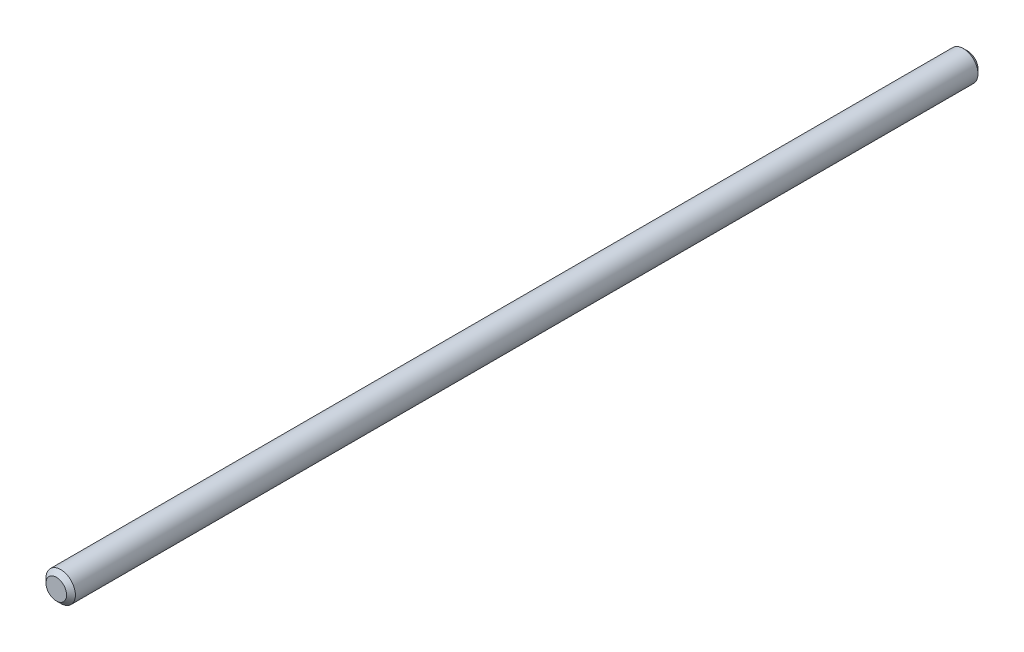
ISO-10303-21;
HEADER;
FILE_DESCRIPTION(('STEP AP214'),'2;1');
FILE_NAME('part.step','',(''),(''),'','','');
FILE_SCHEMA(('AUTOMOTIVE_DESIGN { 1 0 10303 214 1 1 1 1 }'));
ENDSEC;
DATA;
#1=APPLICATION_CONTEXT('core data for automotive mechanical design processes');
#2=APPLICATION_PROTOCOL_DEFINITION('international standard','automotive_design',2000,#1);
#3=PRODUCT_CONTEXT('',#1,'mechanical');
#4=PRODUCT('Part','Part','',(#3));
#5=PRODUCT_RELATED_PRODUCT_CATEGORY('part','',(#4));
#6=PRODUCT_DEFINITION_FORMATION('','',#4);
#7=PRODUCT_DEFINITION_CONTEXT('part definition',#1,'design');
#8=PRODUCT_DEFINITION('design','',#6,#7);
#9=PRODUCT_DEFINITION_SHAPE('','',#8);
#10=(LENGTH_UNIT() NAMED_UNIT(*) SI_UNIT(.MILLI.,.METRE.));
#11=(NAMED_UNIT(*) PLANE_ANGLE_UNIT() SI_UNIT($,.RADIAN.));
#12=(NAMED_UNIT(*) SI_UNIT($,.STERADIAN.) SOLID_ANGLE_UNIT());
#13=UNCERTAINTY_MEASURE_WITH_UNIT(LENGTH_MEASURE(1.E-05),#10,'distance_accuracy_value','');
#14=(GEOMETRIC_REPRESENTATION_CONTEXT(3) GLOBAL_UNCERTAINTY_ASSIGNED_CONTEXT((#13)) GLOBAL_UNIT_ASSIGNED_CONTEXT((#10,
#11,#12)) REPRESENTATION_CONTEXT('',''));
#15=CARTESIAN_POINT('',(0.,0.,0.));
#16=DIRECTION('',(0.,0.,1.));
#17=DIRECTION('',(1.,0.,0.));
#18=AXIS2_PLACEMENT_3D('',#15,#16,#17);
#19=CARTESIAN_POINT('',(0.,0.,155.));
#20=DIRECTION('',(0.,0.,-1.));
#21=DIRECTION('',(-1.,0.,0.));
#22=AXIS2_PLACEMENT_3D('',#19,#20,#21);
#23=CYLINDRICAL_SURFACE('',#22,2.5);
#24=CARTESIAN_POINT('',(0.,0.,0.749999999999945));
#25=DIRECTION('',(0.,0.,1.));
#26=DIRECTION('',(1.,0.,0.));
#27=AXIS2_PLACEMENT_3D('',#24,#25,#26);
#28=CIRCLE('',#27,2.5);
#29=CARTESIAN_POINT('',(2.5,0.,0.749999999999945));
#30=VERTEX_POINT('',#29);
#31=EDGE_CURVE('E42',#30,#30,#28,.T.);
#32=ORIENTED_EDGE('',*,*,#31,.T.);
#33=EDGE_LOOP('',(#32));
#34=FACE_BOUND('',#33,.T.);
#35=CARTESIAN_POINT('',(0.,0.,154.25));
#36=DIRECTION('',(0.,0.,1.));
#37=DIRECTION('',(1.,0.,0.));
#38=AXIS2_PLACEMENT_3D('',#35,#36,#37);
#39=CIRCLE('',#38,2.5);
#40=CARTESIAN_POINT('',(2.5,0.,154.25));
#41=VERTEX_POINT('',#40);
#42=EDGE_CURVE('E46',#41,#41,#39,.F.);
#43=ORIENTED_EDGE('',*,*,#42,.T.);
#44=EDGE_LOOP('',(#43));
#45=FACE_BOUND('',#44,.T.);
#46=ADVANCED_FACE('F31',(#34,#45),#23,.T.);
#47=CARTESIAN_POINT('',(0.,0.,155.));
#48=DIRECTION('',(0.,0.,1.));
#49=DIRECTION('',(1.,0.,0.));
#50=AXIS2_PLACEMENT_3D('',#47,#48,#49);
#51=PLANE('',#50);
#52=CARTESIAN_POINT('',(0.,0.,155.));
#53=DIRECTION('',(0.,0.,1.));
#54=DIRECTION('',(1.,0.,0.));
#55=AXIS2_PLACEMENT_3D('',#52,#53,#54);
#56=CIRCLE('',#55,1.75);
#57=CARTESIAN_POINT('',(1.75,0.,155.));
#58=VERTEX_POINT('',#57);
#59=EDGE_CURVE('E10',#58,#58,#56,.T.);
#60=ORIENTED_EDGE('',*,*,#59,.T.);
#61=EDGE_LOOP('',(#60));
#62=FACE_BOUND('',#61,.T.);
#63=ADVANCED_FACE('F62',(#62),#51,.T.);
#64=CARTESIAN_POINT('',(0.,0.,0.));
#65=DIRECTION('',(0.,0.,1.));
#66=DIRECTION('',(1.,0.,0.));
#67=AXIS2_PLACEMENT_3D('',#64,#65,#66);
#68=PLANE('',#67);
#69=CARTESIAN_POINT('',(0.,0.,0.));
#70=DIRECTION('',(0.,0.,1.));
#71=DIRECTION('',(1.,0.,0.));
#72=AXIS2_PLACEMENT_3D('',#69,#70,#71);
#73=CIRCLE('',#72,1.75000000000006);
#74=CARTESIAN_POINT('',(1.75000000000006,0.,0.));
#75=VERTEX_POINT('',#74);
#76=EDGE_CURVE('E38',#75,#75,#73,.F.);
#77=ORIENTED_EDGE('',*,*,#76,.T.);
#78=EDGE_LOOP('',(#77));
#79=FACE_BOUND('',#78,.T.);
#80=ADVANCED_FACE('F59',(#79),#68,.F.);
#81=CARTESIAN_POINT('',(0.,0.,0.749999999999945));
#82=DIRECTION('',(0.,0.,1.));
#83=DIRECTION('',(1.,0.,0.));
#84=AXIS2_PLACEMENT_3D('',#81,#82,#83);
#85=CONICAL_SURFACE('',#84,2.5,0.785398163397447);
#86=ORIENTED_EDGE('',*,*,#76,.F.);
#87=EDGE_LOOP('',(#86));
#88=FACE_BOUND('',#87,.T.);
#89=ORIENTED_EDGE('',*,*,#31,.F.);
#90=EDGE_LOOP('',(#89));
#91=FACE_BOUND('',#90,.T.);
#92=ADVANCED_FACE('F55',(#88,#91),#85,.T.);
#93=CARTESIAN_POINT('',(0.,0.,155.));
#94=DIRECTION('',(0.,0.,-1.));
#95=DIRECTION('',(-1.,0.,0.));
#96=AXIS2_PLACEMENT_3D('',#93,#94,#95);
#97=CONICAL_SURFACE('',#96,1.75,0.785398163397447);
#98=ORIENTED_EDGE('',*,*,#42,.F.);
#99=EDGE_LOOP('',(#98));
#100=FACE_BOUND('',#99,.T.);
#101=ORIENTED_EDGE('',*,*,#59,.F.);
#102=EDGE_LOOP('',(#101));
#103=FACE_BOUND('',#102,.T.);
#104=ADVANCED_FACE('F33',(#100,#103),#97,.T.);
#105=CLOSED_SHELL('',(#46,#63,#80,#92,#104));
#106=MANIFOLD_SOLID_BREP('B2',#105);
#107=ADVANCED_BREP_SHAPE_REPRESENTATION('',(#18,#106),#14);
#108=SHAPE_DEFINITION_REPRESENTATION(#9,#107);
ENDSEC;
END-ISO-10303-21;
